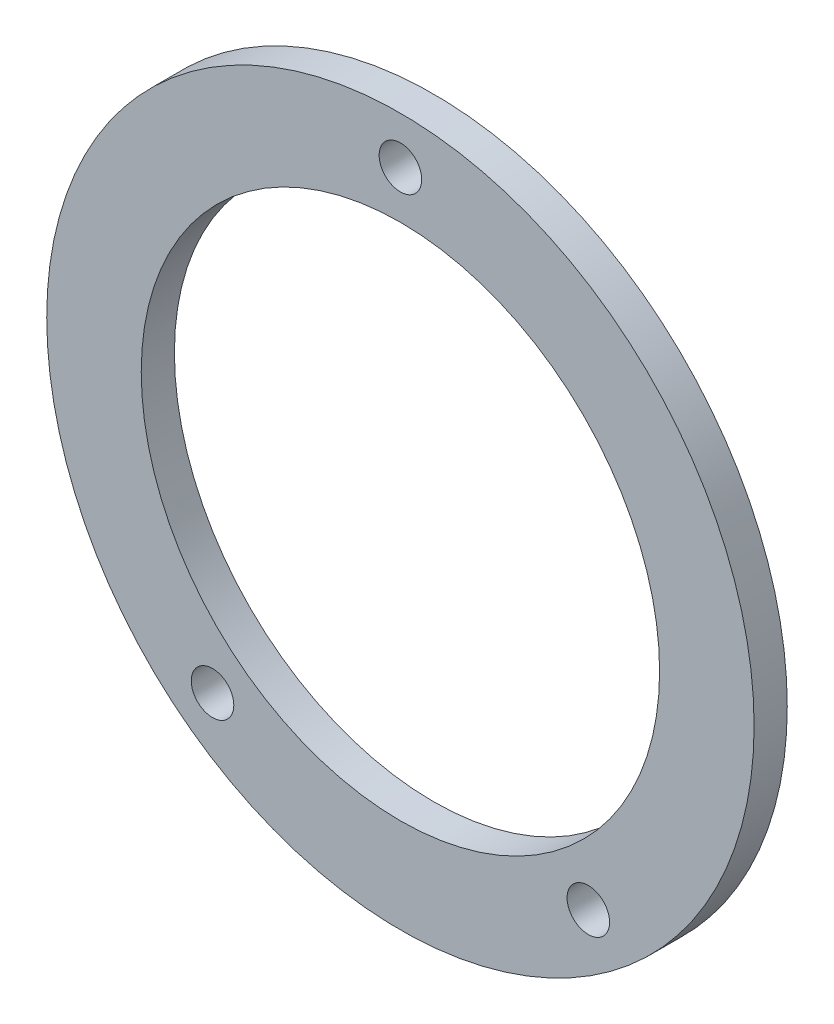
ISO-10303-21;
HEADER;
FILE_DESCRIPTION(('STEP AP214'),'2;1');
FILE_NAME('part.step','',(''),(''),'','','');
FILE_SCHEMA(('AUTOMOTIVE_DESIGN { 1 0 10303 214 1 1 1 1 }'));
ENDSEC;
DATA;
#1=APPLICATION_CONTEXT('core data for automotive mechanical design processes');
#2=APPLICATION_PROTOCOL_DEFINITION('international standard','automotive_design',2000,#1);
#3=PRODUCT_CONTEXT('',#1,'mechanical');
#4=PRODUCT('Part','Part','',(#3));
#5=PRODUCT_RELATED_PRODUCT_CATEGORY('part','',(#4));
#6=PRODUCT_DEFINITION_FORMATION('','',#4);
#7=PRODUCT_DEFINITION_CONTEXT('part definition',#1,'design');
#8=PRODUCT_DEFINITION('design','',#6,#7);
#9=PRODUCT_DEFINITION_SHAPE('','',#8);
#10=(LENGTH_UNIT() NAMED_UNIT(*) SI_UNIT(.MILLI.,.METRE.));
#11=(NAMED_UNIT(*) PLANE_ANGLE_UNIT() SI_UNIT($,.RADIAN.));
#12=(NAMED_UNIT(*) SI_UNIT($,.STERADIAN.) SOLID_ANGLE_UNIT());
#13=UNCERTAINTY_MEASURE_WITH_UNIT(LENGTH_MEASURE(1.E-05),#10,'distance_accuracy_value','');
#14=(GEOMETRIC_REPRESENTATION_CONTEXT(3) GLOBAL_UNCERTAINTY_ASSIGNED_CONTEXT((#13)) GLOBAL_UNIT_ASSIGNED_CONTEXT((#10,
#11,#12)) REPRESENTATION_CONTEXT('',''));
#15=CARTESIAN_POINT('',(0.,0.,0.));
#16=DIRECTION('',(0.,0.,1.));
#17=DIRECTION('',(1.,0.,0.));
#18=AXIS2_PLACEMENT_3D('',#15,#16,#17);
#19=CARTESIAN_POINT('',(-3.84371333086899E-10,1.88482157484113E-10,3.));
#20=DIRECTION('',(0.,0.,1.));
#21=DIRECTION('',(1.,0.,0.));
#22=AXIS2_PLACEMENT_3D('',#19,#20,#21);
#23=PLANE('',#22);
#24=CARTESIAN_POINT('',(-16.999999999057,-21.9331370313702,3.));
#25=DIRECTION('',(0.,0.,1.));
#26=DIRECTION('',(1.,0.,0.));
#27=AXIS2_PLACEMENT_3D('',#24,#25,#26);
#28=CIRCLE('',#27,1.925);
#29=CARTESIAN_POINT('',(-15.074999999057,-21.9331370313702,3.));
#30=VERTEX_POINT('',#29);
#31=EDGE_CURVE('E52',#30,#30,#28,.T.);
#32=ORIENTED_EDGE('',*,*,#31,.F.);
#33=EDGE_LOOP('',(#32));
#34=FACE_BOUND('',#33,.T.);
#35=CARTESIAN_POINT('',(-3.84371333086899E-10,1.88482157484113E-10,3.));
#36=DIRECTION('',(0.,0.,1.));
#37=DIRECTION('',(1.,0.,0.));
#38=AXIS2_PLACEMENT_3D('',#35,#36,#37);
#39=CIRCLE('',#38,23.45);
#40=CARTESIAN_POINT('',(23.4499999996156,1.88482157484113E-10,3.));
#41=VERTEX_POINT('',#40);
#42=EDGE_CURVE('E41',#41,#41,#39,.T.);
#43=ORIENTED_EDGE('',*,*,#42,.F.);
#44=EDGE_LOOP('',(#43));
#45=FACE_BOUND('',#44,.T.);
#46=CARTESIAN_POINT('',(-3.84371333086899E-10,1.88482157484113E-10,3.));
#47=DIRECTION('',(0.,0.,1.));
#48=DIRECTION('',(1.,0.,0.));
#49=AXIS2_PLACEMENT_3D('',#46,#47,#48);
#50=CIRCLE('',#49,32.);
#51=CARTESIAN_POINT('',(31.9999999996156,1.88482157484113E-10,3.));
#52=VERTEX_POINT('',#51);
#53=EDGE_CURVE('E10',#52,#52,#50,.T.);
#54=ORIENTED_EDGE('',*,*,#53,.T.);
#55=EDGE_LOOP('',(#54));
#56=FACE_BOUND('',#55,.T.);
#57=CARTESIAN_POINT('',(16.9999999982883,-21.9331370313702,3.));
#58=DIRECTION('',(0.,0.,1.));
#59=DIRECTION('',(1.,0.,0.));
#60=AXIS2_PLACEMENT_3D('',#57,#58,#59);
#61=CIRCLE('',#60,1.925);
#62=CARTESIAN_POINT('',(18.9249999982883,-21.9331370313702,3.));
#63=VERTEX_POINT('',#62);
#64=EDGE_CURVE('E46',#63,#63,#61,.T.);
#65=ORIENTED_EDGE('',*,*,#64,.F.);
#66=EDGE_LOOP('',(#65));
#67=FACE_BOUND('',#66,.T.);
#68=CARTESIAN_POINT('',(-3.84371333086899E-10,27.7500000001885,3.));
#69=DIRECTION('',(0.,0.,1.));
#70=DIRECTION('',(1.,0.,0.));
#71=AXIS2_PLACEMENT_3D('',#68,#69,#70);
#72=CIRCLE('',#71,1.925);
#73=CARTESIAN_POINT('',(1.92499999961563,27.7500000001885,3.));
#74=VERTEX_POINT('',#73);
#75=EDGE_CURVE('E58',#74,#74,#72,.T.);
#76=ORIENTED_EDGE('',*,*,#75,.F.);
#77=EDGE_LOOP('',(#76));
#78=FACE_BOUND('',#77,.T.);
#79=ADVANCED_FACE('F30',(#34,#45,#56,#67,#78),#23,.T.);
#80=CARTESIAN_POINT('',(-3.84371333086899E-10,1.88482157484113E-10,0.));
#81=DIRECTION('',(0.,0.,1.));
#82=DIRECTION('',(1.,0.,0.));
#83=AXIS2_PLACEMENT_3D('',#80,#81,#82);
#84=PLANE('',#83);
#85=CARTESIAN_POINT('',(-3.84371333086899E-10,1.88482157484113E-10,0.));
#86=DIRECTION('',(0.,0.,1.));
#87=DIRECTION('',(1.,0.,0.));
#88=AXIS2_PLACEMENT_3D('',#85,#86,#87);
#89=CIRCLE('',#88,32.);
#90=CARTESIAN_POINT('',(31.9999999996156,1.88482157484113E-10,0.));
#91=VERTEX_POINT('',#90);
#92=EDGE_CURVE('E34',#91,#91,#89,.T.);
#93=ORIENTED_EDGE('',*,*,#92,.F.);
#94=EDGE_LOOP('',(#93));
#95=FACE_BOUND('',#94,.T.);
#96=CARTESIAN_POINT('',(-3.84371333086899E-10,1.88482157484113E-10,0.));
#97=DIRECTION('',(0.,0.,1.));
#98=DIRECTION('',(1.,0.,0.));
#99=AXIS2_PLACEMENT_3D('',#96,#97,#98);
#100=CIRCLE('',#99,23.45);
#101=CARTESIAN_POINT('',(23.4499999996156,1.88482157484113E-10,0.));
#102=VERTEX_POINT('',#101);
#103=EDGE_CURVE('E43',#102,#102,#100,.T.);
#104=ORIENTED_EDGE('',*,*,#103,.T.);
#105=EDGE_LOOP('',(#104));
#106=FACE_BOUND('',#105,.T.);
#107=CARTESIAN_POINT('',(16.9999999982883,-21.9331370313702,0.));
#108=DIRECTION('',(0.,0.,1.));
#109=DIRECTION('',(1.,0.,0.));
#110=AXIS2_PLACEMENT_3D('',#107,#108,#109);
#111=CIRCLE('',#110,1.925);
#112=CARTESIAN_POINT('',(18.9249999982883,-21.9331370313702,0.));
#113=VERTEX_POINT('',#112);
#114=EDGE_CURVE('E49',#113,#113,#111,.T.);
#115=ORIENTED_EDGE('',*,*,#114,.T.);
#116=EDGE_LOOP('',(#115));
#117=FACE_BOUND('',#116,.T.);
#118=CARTESIAN_POINT('',(-16.999999999057,-21.9331370313702,0.));
#119=DIRECTION('',(0.,0.,1.));
#120=DIRECTION('',(1.,0.,0.));
#121=AXIS2_PLACEMENT_3D('',#118,#119,#120);
#122=CIRCLE('',#121,1.925);
#123=CARTESIAN_POINT('',(-15.074999999057,-21.9331370313702,0.));
#124=VERTEX_POINT('',#123);
#125=EDGE_CURVE('E55',#124,#124,#122,.T.);
#126=ORIENTED_EDGE('',*,*,#125,.T.);
#127=EDGE_LOOP('',(#126));
#128=FACE_BOUND('',#127,.T.);
#129=CARTESIAN_POINT('',(-3.84371333086899E-10,27.7500000001885,0.));
#130=DIRECTION('',(0.,0.,1.));
#131=DIRECTION('',(1.,0.,0.));
#132=AXIS2_PLACEMENT_3D('',#129,#130,#131);
#133=CIRCLE('',#132,1.925);
#134=CARTESIAN_POINT('',(1.92499999961563,27.7500000001885,0.));
#135=VERTEX_POINT('',#134);
#136=EDGE_CURVE('E61',#135,#135,#133,.T.);
#137=ORIENTED_EDGE('',*,*,#136,.T.);
#138=EDGE_LOOP('',(#137));
#139=FACE_BOUND('',#138,.T.);
#140=ADVANCED_FACE('F71',(#95,#106,#117,#128,#139),#84,.F.);
#141=CARTESIAN_POINT('',(-3.84371333086899E-10,1.88482157484113E-10,3.));
#142=DIRECTION('',(0.,0.,-1.));
#143=DIRECTION('',(-1.,0.,0.));
#144=AXIS2_PLACEMENT_3D('',#141,#142,#143);
#145=CYLINDRICAL_SURFACE('',#144,32.);
#146=ORIENTED_EDGE('',*,*,#53,.F.);
#147=EDGE_LOOP('',(#146));
#148=FACE_BOUND('',#147,.T.);
#149=ORIENTED_EDGE('',*,*,#92,.T.);
#150=EDGE_LOOP('',(#149));
#151=FACE_BOUND('',#150,.T.);
#152=ADVANCED_FACE('F32',(#148,#151),#145,.T.);
#153=CARTESIAN_POINT('',(-3.84371333086899E-10,1.88482157484113E-10,3.));
#154=DIRECTION('',(0.,0.,-1.));
#155=DIRECTION('',(-1.,0.,0.));
#156=AXIS2_PLACEMENT_3D('',#153,#154,#155);
#157=CYLINDRICAL_SURFACE('',#156,23.45);
#158=ORIENTED_EDGE('',*,*,#42,.T.);
#159=EDGE_LOOP('',(#158));
#160=FACE_BOUND('',#159,.T.);
#161=ORIENTED_EDGE('',*,*,#103,.F.);
#162=EDGE_LOOP('',(#161));
#163=FACE_BOUND('',#162,.T.);
#164=ADVANCED_FACE('F81',(#160,#163),#157,.F.);
#165=CARTESIAN_POINT('',(16.9999999982883,-21.9331370313702,3.));
#166=DIRECTION('',(0.,0.,-1.));
#167=DIRECTION('',(-1.,0.,0.));
#168=AXIS2_PLACEMENT_3D('',#165,#166,#167);
#169=CYLINDRICAL_SURFACE('',#168,1.925);
#170=ORIENTED_EDGE('',*,*,#64,.T.);
#171=EDGE_LOOP('',(#170));
#172=FACE_BOUND('',#171,.T.);
#173=ORIENTED_EDGE('',*,*,#114,.F.);
#174=EDGE_LOOP('',(#173));
#175=FACE_BOUND('',#174,.T.);
#176=ADVANCED_FACE('F84',(#172,#175),#169,.F.);
#177=CARTESIAN_POINT('',(-16.999999999057,-21.9331370313702,3.));
#178=DIRECTION('',(0.,0.,-1.));
#179=DIRECTION('',(-1.,0.,0.));
#180=AXIS2_PLACEMENT_3D('',#177,#178,#179);
#181=CYLINDRICAL_SURFACE('',#180,1.925);
#182=ORIENTED_EDGE('',*,*,#31,.T.);
#183=EDGE_LOOP('',(#182));
#184=FACE_BOUND('',#183,.T.);
#185=ORIENTED_EDGE('',*,*,#125,.F.);
#186=EDGE_LOOP('',(#185));
#187=FACE_BOUND('',#186,.T.);
#188=ADVANCED_FACE('F88',(#184,#187),#181,.F.);
#189=CARTESIAN_POINT('',(-3.84371333086899E-10,27.7500000001885,3.));
#190=DIRECTION('',(0.,0.,-1.));
#191=DIRECTION('',(-1.,0.,0.));
#192=AXIS2_PLACEMENT_3D('',#189,#190,#191);
#193=CYLINDRICAL_SURFACE('',#192,1.925);
#194=ORIENTED_EDGE('',*,*,#75,.T.);
#195=EDGE_LOOP('',(#194));
#196=FACE_BOUND('',#195,.T.);
#197=ORIENTED_EDGE('',*,*,#136,.F.);
#198=EDGE_LOOP('',(#197));
#199=FACE_BOUND('',#198,.T.);
#200=ADVANCED_FACE('F67',(#196,#199),#193,.F.);
#201=CLOSED_SHELL('',(#79,#140,#152,#164,#176,#188,#200));
#202=MANIFOLD_SOLID_BREP('B2',#201);
#203=ADVANCED_BREP_SHAPE_REPRESENTATION('',(#18,#202),#14);
#204=SHAPE_DEFINITION_REPRESENTATION(#9,#203);
ENDSEC;
END-ISO-10303-21;
